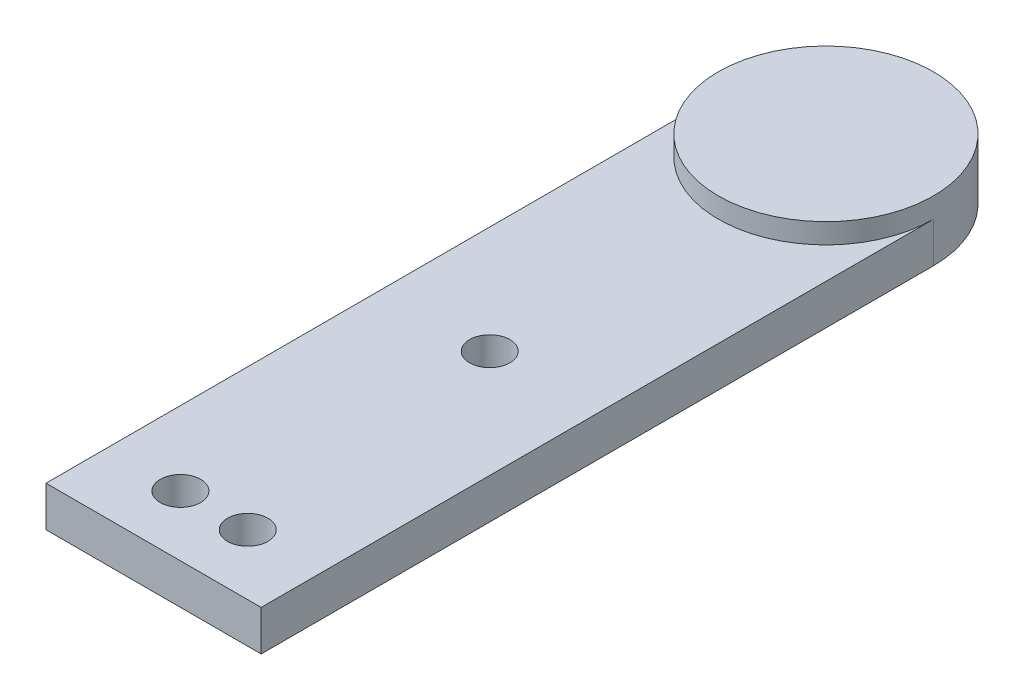
ISO-10303-21;
HEADER;
FILE_DESCRIPTION(('STEP AP214'),'2;1');
FILE_NAME('part.step','',(''),(''),'','','');
FILE_SCHEMA(('AUTOMOTIVE_DESIGN { 1 0 10303 214 1 1 1 1 }'));
ENDSEC;
DATA;
#1=APPLICATION_CONTEXT('core data for automotive mechanical design processes');
#2=APPLICATION_PROTOCOL_DEFINITION('international standard','automotive_design',2000,#1);
#3=PRODUCT_CONTEXT('',#1,'mechanical');
#4=PRODUCT('Part','Part','',(#3));
#5=PRODUCT_RELATED_PRODUCT_CATEGORY('part','',(#4));
#6=PRODUCT_DEFINITION_FORMATION('','',#4);
#7=PRODUCT_DEFINITION_CONTEXT('part definition',#1,'design');
#8=PRODUCT_DEFINITION('design','',#6,#7);
#9=PRODUCT_DEFINITION_SHAPE('','',#8);
#10=(LENGTH_UNIT() NAMED_UNIT(*) SI_UNIT(.MILLI.,.METRE.));
#11=(NAMED_UNIT(*) PLANE_ANGLE_UNIT() SI_UNIT($,.RADIAN.));
#12=(NAMED_UNIT(*) SI_UNIT($,.STERADIAN.) SOLID_ANGLE_UNIT());
#13=UNCERTAINTY_MEASURE_WITH_UNIT(LENGTH_MEASURE(1.E-05),#10,'distance_accuracy_value','');
#14=(GEOMETRIC_REPRESENTATION_CONTEXT(3) GLOBAL_UNCERTAINTY_ASSIGNED_CONTEXT((#13)) GLOBAL_UNIT_ASSIGNED_CONTEXT((#10,
#11,#12)) REPRESENTATION_CONTEXT('',''));
#15=CARTESIAN_POINT('',(0.,0.,0.));
#16=DIRECTION('',(0.,0.,1.));
#17=DIRECTION('',(1.,0.,0.));
#18=AXIS2_PLACEMENT_3D('',#15,#16,#17);
#19=CARTESIAN_POINT('',(0.,3.,0.));
#20=DIRECTION('',(0.,-1.,0.));
#21=DIRECTION('',(0.,0.,-1.));
#22=AXIS2_PLACEMENT_3D('',#19,#20,#21);
#23=CYLINDRICAL_SURFACE('',#22,8.);
#24=CARTESIAN_POINT('',(0.,3.,0.));
#25=DIRECTION('',(0.,1.,0.));
#26=DIRECTION('',(0.,0.,1.));
#27=AXIS2_PLACEMENT_3D('',#24,#25,#26);
#28=CIRCLE('',#27,8.);
#29=CARTESIAN_POINT('',(0.,3.,8.));
#30=VERTEX_POINT('',#29);
#31=EDGE_CURVE('E45',#30,#30,#28,.T.);
#32=ORIENTED_EDGE('',*,*,#31,.F.);
#33=EDGE_LOOP('',(#32));
#34=FACE_BOUND('',#33,.T.);
#35=DIRECTION('',(0.,-1.,0.));
#36=VECTOR('',#35,1.);
#37=CARTESIAN_POINT('',(-8.,1.5,0.));
#38=LINE('',#37,#36);
#39=CARTESIAN_POINT('',(-8.,1.5,0.));
#40=VERTEX_POINT('',#39);
#41=CARTESIAN_POINT('',(-8.,-1.5,0.));
#42=VERTEX_POINT('',#41);
#43=EDGE_CURVE('E55',#40,#42,#38,.T.);
#44=ORIENTED_EDGE('',*,*,#43,.F.);
#45=CARTESIAN_POINT('',(0.,1.5,0.));
#46=DIRECTION('',(0.,1.,0.));
#47=DIRECTION('',(0.,0.,1.));
#48=AXIS2_PLACEMENT_3D('',#45,#46,#47);
#49=CIRCLE('',#48,8.);
#50=CARTESIAN_POINT('',(8.,1.5,0.));
#51=VERTEX_POINT('',#50);
#52=EDGE_CURVE('E11',#40,#51,#49,.T.);
#53=ORIENTED_EDGE('',*,*,#52,.T.);
#54=DIRECTION('',(0.,-1.,0.));
#55=VECTOR('',#54,1.);
#56=CARTESIAN_POINT('',(8.,1.5,0.));
#57=LINE('',#56,#55);
#58=CARTESIAN_POINT('',(8.,-1.5,0.));
#59=VERTEX_POINT('',#58);
#60=EDGE_CURVE('E99',#51,#59,#57,.T.);
#61=ORIENTED_EDGE('',*,*,#60,.T.);
#62=CARTESIAN_POINT('',(0.,-1.5,0.));
#63=DIRECTION('',(0.,1.,0.));
#64=DIRECTION('',(0.,0.,1.));
#65=AXIS2_PLACEMENT_3D('',#62,#63,#64);
#66=CIRCLE('',#65,8.);
#67=EDGE_CURVE('E96',#59,#42,#66,.T.);
#68=ORIENTED_EDGE('',*,*,#67,.T.);
#69=EDGE_LOOP('',(#44,#53,#61,#68));
#70=FACE_BOUND('',#69,.T.);
#71=ADVANCED_FACE('F37',(#34,#70),#23,.T.);
#72=CARTESIAN_POINT('',(0.,3.,0.));
#73=DIRECTION('',(0.,1.,0.));
#74=DIRECTION('',(0.,0.,1.));
#75=AXIS2_PLACEMENT_3D('',#72,#73,#74);
#76=PLANE('',#75);
#77=ORIENTED_EDGE('',*,*,#31,.T.);
#78=EDGE_LOOP('',(#77));
#79=FACE_BOUND('',#78,.T.);
#80=ADVANCED_FACE('F106',(#79),#76,.T.);
#81=CARTESIAN_POINT('',(0.,-1.5,0.));
#82=DIRECTION('',(0.,1.,0.));
#83=DIRECTION('',(0.,0.,1.));
#84=AXIS2_PLACEMENT_3D('',#81,#82,#83);
#85=PLANE('',#84);
#86=CARTESIAN_POINT('',(0.,-1.5,25.));
#87=DIRECTION('',(0.,1.,0.));
#88=DIRECTION('',(0.,0.,1.));
#89=AXIS2_PLACEMENT_3D('',#86,#87,#88);
#90=CIRCLE('',#89,1.5);
#91=CARTESIAN_POINT('',(0.,-1.5,26.5));
#92=VERTEX_POINT('',#91);
#93=EDGE_CURVE('E153',#92,#92,#90,.F.);
#94=ORIENTED_EDGE('',*,*,#93,.F.);
#95=EDGE_LOOP('',(#94));
#96=FACE_BOUND('',#95,.T.);
#97=CARTESIAN_POINT('',(0.,-1.5,0.));
#98=DIRECTION('',(0.,1.,0.));
#99=DIRECTION('',(0.,0.,1.));
#100=AXIS2_PLACEMENT_3D('',#97,#98,#99);
#101=CIRCLE('',#100,3.3);
#102=CARTESIAN_POINT('',(0.,-1.5,3.3));
#103=VERTEX_POINT('',#102);
#104=EDGE_CURVE('E40',#103,#103,#101,.T.);
#105=ORIENTED_EDGE('',*,*,#104,.T.);
#106=EDGE_LOOP('',(#105));
#107=FACE_BOUND('',#106,.T.);
#108=CARTESIAN_POINT('',(-2.50307341777024,-1.5,45.5));
#109=DIRECTION('',(0.,-1.,0.));
#110=DIRECTION('',(0.,0.,-1.));
#111=AXIS2_PLACEMENT_3D('',#108,#109,#110);
#112=CIRCLE('',#111,1.5);
#113=CARTESIAN_POINT('',(-2.50307341777024,-1.5,44.));
#114=VERTEX_POINT('',#113);
#115=EDGE_CURVE('E159',#114,#114,#112,.T.);
#116=ORIENTED_EDGE('',*,*,#115,.F.);
#117=EDGE_LOOP('',(#116));
#118=FACE_BOUND('',#117,.T.);
#119=CARTESIAN_POINT('',(2.50307341776999,-1.5,45.5));
#120=DIRECTION('',(0.,-1.,0.));
#121=DIRECTION('',(0.,0.,-1.));
#122=AXIS2_PLACEMENT_3D('',#119,#120,#121);
#123=CIRCLE('',#122,1.5);
#124=CARTESIAN_POINT('',(2.50307341776999,-1.5,44.));
#125=VERTEX_POINT('',#124);
#126=EDGE_CURVE('E156',#125,#125,#123,.T.);
#127=ORIENTED_EDGE('',*,*,#126,.F.);
#128=EDGE_LOOP('',(#127));
#129=FACE_BOUND('',#128,.T.);
#130=ORIENTED_EDGE('',*,*,#67,.F.);
#131=DIRECTION('',(0.,0.,-1.));
#132=VECTOR('',#131,1.);
#133=CARTESIAN_POINT('',(8.,-1.5,0.));
#134=LINE('',#133,#132);
#135=CARTESIAN_POINT('',(8.00000000000001,-1.5,50.));
#136=VERTEX_POINT('',#135);
#137=EDGE_CURVE('E91',#136,#59,#134,.T.);
#138=ORIENTED_EDGE('',*,*,#137,.F.);
#139=DIRECTION('',(1.,0.,0.));
#140=VECTOR('',#139,1.);
#141=CARTESIAN_POINT('',(-8.00000000000001,-1.5,50.));
#142=LINE('',#141,#140);
#143=CARTESIAN_POINT('',(-8.00000000000001,-1.5,50.));
#144=VERTEX_POINT('',#143);
#145=EDGE_CURVE('E172',#144,#136,#142,.T.);
#146=ORIENTED_EDGE('',*,*,#145,.F.);
#147=DIRECTION('',(0.,0.,1.));
#148=VECTOR('',#147,1.);
#149=CARTESIAN_POINT('',(-8.,-1.5,0.));
#150=LINE('',#149,#148);
#151=EDGE_CURVE('E95',#42,#144,#150,.T.);
#152=ORIENTED_EDGE('',*,*,#151,.F.);
#153=EDGE_LOOP('',(#130,#138,#146,#152));
#154=FACE_BOUND('',#153,.T.);
#155=ADVANCED_FACE('F112',(#96,#107,#118,#129,#154),#85,.F.);
#156=CARTESIAN_POINT('',(-8.,1.5,0.));
#157=DIRECTION('',(1.,0.,0.));
#158=DIRECTION('',(0.,0.,-1.));
#159=AXIS2_PLACEMENT_3D('',#156,#157,#158);
#160=PLANE('',#159);
#161=ORIENTED_EDGE('',*,*,#151,.T.);
#162=DIRECTION('',(0.,-1.,0.));
#163=VECTOR('',#162,1.);
#164=CARTESIAN_POINT('',(-8.00000000000001,1.5,50.));
#165=LINE('',#164,#163);
#166=CARTESIAN_POINT('',(-8.00000000000001,1.5,50.));
#167=VERTEX_POINT('',#166);
#168=EDGE_CURVE('E79',#167,#144,#165,.T.);
#169=ORIENTED_EDGE('',*,*,#168,.F.);
#170=DIRECTION('',(0.,0.,1.));
#171=VECTOR('',#170,1.);
#172=CARTESIAN_POINT('',(-8.,1.5,0.));
#173=LINE('',#172,#171);
#174=EDGE_CURVE('E86',#40,#167,#173,.T.);
#175=ORIENTED_EDGE('',*,*,#174,.F.);
#176=ORIENTED_EDGE('',*,*,#43,.T.);
#177=EDGE_LOOP('',(#161,#169,#175,#176));
#178=FACE_BOUND('',#177,.T.);
#179=ADVANCED_FACE('F93',(#178),#160,.F.);
#180=CARTESIAN_POINT('',(-8.00000000000001,1.5,50.));
#181=DIRECTION('',(0.,0.,-1.));
#182=DIRECTION('',(-1.,0.,0.));
#183=AXIS2_PLACEMENT_3D('',#180,#181,#182);
#184=PLANE('',#183);
#185=ORIENTED_EDGE('',*,*,#145,.T.);
#186=DIRECTION('',(0.,-1.,0.));
#187=VECTOR('',#186,1.);
#188=CARTESIAN_POINT('',(8.00000000000001,1.5,50.));
#189=LINE('',#188,#187);
#190=CARTESIAN_POINT('',(8.00000000000001,1.5,50.));
#191=VERTEX_POINT('',#190);
#192=EDGE_CURVE('E82',#191,#136,#189,.T.);
#193=ORIENTED_EDGE('',*,*,#192,.F.);
#194=DIRECTION('',(1.,0.,0.));
#195=VECTOR('',#194,1.);
#196=CARTESIAN_POINT('',(-8.00000000000001,1.5,50.));
#197=LINE('',#196,#195);
#198=EDGE_CURVE('E75',#167,#191,#197,.T.);
#199=ORIENTED_EDGE('',*,*,#198,.F.);
#200=ORIENTED_EDGE('',*,*,#168,.T.);
#201=EDGE_LOOP('',(#185,#193,#199,#200));
#202=FACE_BOUND('',#201,.T.);
#203=ADVANCED_FACE('F77',(#202),#184,.F.);
#204=CARTESIAN_POINT('',(8.,1.5,0.));
#205=DIRECTION('',(-1.,0.,0.));
#206=DIRECTION('',(0.,0.,1.));
#207=AXIS2_PLACEMENT_3D('',#204,#205,#206);
#208=PLANE('',#207);
#209=ORIENTED_EDGE('',*,*,#137,.T.);
#210=ORIENTED_EDGE('',*,*,#60,.F.);
#211=DIRECTION('',(0.,0.,-1.));
#212=VECTOR('',#211,1.);
#213=CARTESIAN_POINT('',(8.,1.5,0.));
#214=LINE('',#213,#212);
#215=EDGE_CURVE('E85',#191,#51,#214,.T.);
#216=ORIENTED_EDGE('',*,*,#215,.F.);
#217=ORIENTED_EDGE('',*,*,#192,.T.);
#218=EDGE_LOOP('',(#209,#210,#216,#217));
#219=FACE_BOUND('',#218,.T.);
#220=ADVANCED_FACE('F123',(#219),#208,.F.);
#221=CARTESIAN_POINT('',(0.,1.5,0.));
#222=DIRECTION('',(0.,1.,0.));
#223=DIRECTION('',(0.,0.,1.));
#224=AXIS2_PLACEMENT_3D('',#221,#222,#223);
#225=PLANE('',#224);
#226=CARTESIAN_POINT('',(0.,1.5,25.));
#227=DIRECTION('',(0.,1.,0.));
#228=DIRECTION('',(0.,0.,1.));
#229=AXIS2_PLACEMENT_3D('',#226,#227,#228);
#230=CIRCLE('',#229,1.5);
#231=CARTESIAN_POINT('',(0.,1.5,26.5));
#232=VERTEX_POINT('',#231);
#233=EDGE_CURVE('E150',#232,#232,#230,.T.);
#234=ORIENTED_EDGE('',*,*,#233,.F.);
#235=EDGE_LOOP('',(#234));
#236=FACE_BOUND('',#235,.T.);
#237=CARTESIAN_POINT('',(-2.50307341777024,1.5,45.5));
#238=DIRECTION('',(0.,1.,0.));
#239=DIRECTION('',(0.,0.,1.));
#240=AXIS2_PLACEMENT_3D('',#237,#238,#239);
#241=CIRCLE('',#240,1.5);
#242=CARTESIAN_POINT('',(-2.50307341777024,1.5,47.));
#243=VERTEX_POINT('',#242);
#244=EDGE_CURVE('E162',#243,#243,#241,.F.);
#245=ORIENTED_EDGE('',*,*,#244,.T.);
#246=EDGE_LOOP('',(#245));
#247=FACE_BOUND('',#246,.T.);
#248=CARTESIAN_POINT('',(2.50307341776999,1.5,45.5));
#249=DIRECTION('',(0.,1.,0.));
#250=DIRECTION('',(0.,0.,1.));
#251=AXIS2_PLACEMENT_3D('',#248,#249,#250);
#252=CIRCLE('',#251,1.5);
#253=CARTESIAN_POINT('',(2.50307341776999,1.5,47.));
#254=VERTEX_POINT('',#253);
#255=EDGE_CURVE('E165',#254,#254,#252,.F.);
#256=ORIENTED_EDGE('',*,*,#255,.T.);
#257=EDGE_LOOP('',(#256));
#258=FACE_BOUND('',#257,.T.);
#259=ORIENTED_EDGE('',*,*,#52,.F.);
#260=ORIENTED_EDGE('',*,*,#174,.T.);
#261=ORIENTED_EDGE('',*,*,#198,.T.);
#262=ORIENTED_EDGE('',*,*,#215,.T.);
#263=EDGE_LOOP('',(#259,#260,#261,#262));
#264=FACE_BOUND('',#263,.T.);
#265=ADVANCED_FACE('F89',(#236,#247,#258,#264),#225,.T.);
#266=CARTESIAN_POINT('',(2.50307341776999,3.001,45.5));
#267=DIRECTION('',(0.,-1.,0.));
#268=DIRECTION('',(0.,0.,-1.));
#269=AXIS2_PLACEMENT_3D('',#266,#267,#268);
#270=CYLINDRICAL_SURFACE('',#269,1.5);
#271=ORIENTED_EDGE('',*,*,#255,.F.);
#272=EDGE_LOOP('',(#271));
#273=FACE_BOUND('',#272,.T.);
#274=ORIENTED_EDGE('',*,*,#126,.T.);
#275=EDGE_LOOP('',(#274));
#276=FACE_BOUND('',#275,.T.);
#277=ADVANCED_FACE('F129',(#273,#276),#270,.F.);
#278=CARTESIAN_POINT('',(-2.50307341777024,3.001,45.5));
#279=DIRECTION('',(0.,-1.,0.));
#280=DIRECTION('',(0.,0.,-1.));
#281=AXIS2_PLACEMENT_3D('',#278,#279,#280);
#282=CYLINDRICAL_SURFACE('',#281,1.5);
#283=ORIENTED_EDGE('',*,*,#244,.F.);
#284=EDGE_LOOP('',(#283));
#285=FACE_BOUND('',#284,.T.);
#286=ORIENTED_EDGE('',*,*,#115,.T.);
#287=EDGE_LOOP('',(#286));
#288=FACE_BOUND('',#287,.T.);
#289=ADVANCED_FACE('F133',(#285,#288),#282,.F.);
#290=CARTESIAN_POINT('',(0.,-1.5,0.));
#291=DIRECTION('',(1.,0.,0.));
#292=DIRECTION('',(0.,0.,-1.));
#293=AXIS2_PLACEMENT_3D('',#290,#291,#292);
#294=SPHERICAL_SURFACE('',#293,3.3);
#295=CARTESIAN_POINT('',(0.,-1.5,0.));
#296=DIRECTION('',(0.,1.,0.));
#297=DIRECTION('',(0.,0.,1.));
#298=AXIS2_PLACEMENT_3D('',#295,#296,#297);
#299=SPHERICAL_SURFACE('',#298,3.3);
#300=ORIENTED_EDGE('',*,*,#104,.F.);
#301=EDGE_LOOP('',(#300));
#302=FACE_BOUND('',#301,.T.);
#303=ADVANCED_FACE('F137',(#302),#299,.F.);
#304=CARTESIAN_POINT('',(0.,-1.501,25.));
#305=DIRECTION('',(0.,1.,0.));
#306=DIRECTION('',(0.,0.,1.));
#307=AXIS2_PLACEMENT_3D('',#304,#305,#306);
#308=CYLINDRICAL_SURFACE('',#307,1.5);
#309=CARTESIAN_POINT('',(0.,1.5,26.5));
#310=CARTESIAN_POINT('',(0.,1.46875,26.5));
#311=CARTESIAN_POINT('',(0.,1.4375,26.5));
#312=CARTESIAN_POINT('',(0.,1.375,26.5));
#313=CARTESIAN_POINT('',(0.,1.34375,26.5));
#314=CARTESIAN_POINT('',(0.,1.28125,26.5));
#315=CARTESIAN_POINT('',(0.,1.25,26.5));
#316=CARTESIAN_POINT('',(0.,1.1875,26.5));
#317=CARTESIAN_POINT('',(0.,1.15625,26.5));
#318=CARTESIAN_POINT('',(0.,1.09375,26.5));
#319=CARTESIAN_POINT('',(0.,1.0625,26.5));
#320=CARTESIAN_POINT('',(0.,1.,26.5));
#321=CARTESIAN_POINT('',(0.,0.96875,26.5));
#322=CARTESIAN_POINT('',(0.,0.90625,26.5));
#323=CARTESIAN_POINT('',(0.,0.874999999999999,26.5));
#324=CARTESIAN_POINT('',(0.,0.8125,26.5));
#325=CARTESIAN_POINT('',(0.,0.78125,26.5));
#326=CARTESIAN_POINT('',(0.,0.71875,26.5));
#327=CARTESIAN_POINT('',(0.,0.6875,26.5));
#328=CARTESIAN_POINT('',(0.,0.625,26.5));
#329=CARTESIAN_POINT('',(0.,0.59375,26.5));
#330=CARTESIAN_POINT('',(0.,0.53125,26.5));
#331=CARTESIAN_POINT('',(0.,0.5,26.5));
#332=CARTESIAN_POINT('',(0.,0.4375,26.5));
#333=CARTESIAN_POINT('',(0.,0.40625,26.5));
#334=CARTESIAN_POINT('',(0.,0.34375,26.5));
#335=CARTESIAN_POINT('',(0.,0.3125,26.5));
#336=CARTESIAN_POINT('',(0.,0.25,26.5));
#337=CARTESIAN_POINT('',(0.,0.21875,26.5));
#338=CARTESIAN_POINT('',(0.,0.15625,26.5));
#339=CARTESIAN_POINT('',(0.,0.125,26.5));
#340=CARTESIAN_POINT('',(0.,0.0624999999999998,26.5));
#341=CARTESIAN_POINT('',(0.,0.0312499999999998,26.5));
#342=CARTESIAN_POINT('',(0.,-0.0312500000000002,26.5));
#343=CARTESIAN_POINT('',(0.,-0.0625000000000003,26.5));
#344=CARTESIAN_POINT('',(0.,-0.125,26.5));
#345=CARTESIAN_POINT('',(0.,-0.15625,26.5));
#346=CARTESIAN_POINT('',(0.,-0.21875,26.5));
#347=CARTESIAN_POINT('',(0.,-0.25,26.5));
#348=CARTESIAN_POINT('',(0.,-0.3125,26.5));
#349=CARTESIAN_POINT('',(0.,-0.34375,26.5));
#350=CARTESIAN_POINT('',(0.,-0.40625,26.5));
#351=CARTESIAN_POINT('',(0.,-0.4375,26.5));
#352=CARTESIAN_POINT('',(0.,-0.5,26.5));
#353=CARTESIAN_POINT('',(0.,-0.53125,26.5));
#354=CARTESIAN_POINT('',(0.,-0.59375,26.5));
#355=CARTESIAN_POINT('',(0.,-0.625,26.5));
#356=CARTESIAN_POINT('',(0.,-0.6875,26.5));
#357=CARTESIAN_POINT('',(0.,-0.71875,26.5));
#358=CARTESIAN_POINT('',(0.,-0.78125,26.5));
#359=CARTESIAN_POINT('',(0.,-0.8125,26.5));
#360=CARTESIAN_POINT('',(0.,-0.875,26.5));
#361=CARTESIAN_POINT('',(0.,-0.90625,26.5));
#362=CARTESIAN_POINT('',(0.,-0.96875,26.5));
#363=CARTESIAN_POINT('',(0.,-1.,26.5));
#364=CARTESIAN_POINT('',(0.,-1.0625,26.5));
#365=CARTESIAN_POINT('',(0.,-1.09375,26.5));
#366=CARTESIAN_POINT('',(0.,-1.15625,26.5));
#367=CARTESIAN_POINT('',(0.,-1.1875,26.5));
#368=CARTESIAN_POINT('',(0.,-1.25,26.5));
#369=CARTESIAN_POINT('',(0.,-1.28125,26.5));
#370=CARTESIAN_POINT('',(0.,-1.34375,26.5));
#371=CARTESIAN_POINT('',(0.,-1.375,26.5));
#372=CARTESIAN_POINT('',(0.,-1.4375,26.5));
#373=CARTESIAN_POINT('',(0.,-1.46875,26.5));
#374=CARTESIAN_POINT('',(0.,-1.5,26.5));
#375=B_SPLINE_CURVE_WITH_KNOTS('',3,(#309,#310,#311,#312,#313,#314,#315,#316,#317,#318,#319,
#320,#321,#322,#323,#324,#325,#326,#327,#328,#329,#330,#331,#332,#333,#334,#335,#336,#337,#338,
#339,#340,#341,#342,#343,#344,#345,#346,#347,#348,#349,#350,#351,#352,#353,#354,#355,#356,#357,
#358,#359,#360,#361,#362,#363,#364,#365,#366,#367,#368,#369,#370,#371,#372,#373,#374),
.UNSPECIFIED.,.F.,.F.,(4,2,2,2,2,2,2,2,2,2,2,2,2,2,2,2,2,2,2,2,2,2,2,2,2,2,2,2,2,2,2,2,4),(0.,
0.0937500000000001,0.1875,0.28125,0.375,0.46875,0.5625,0.65625,0.75,0.84375,0.9375,1.03125,
1.125,1.21875,1.3125,1.40625,1.5,1.59375,1.6875,1.78125,1.875,1.96875,2.0625,2.15625,2.25,
2.34375,2.4375,2.53125,2.625,2.71875,2.8125,2.90625,3.),.UNSPECIFIED.);
#376=EDGE_CURVE('BSEAM141',#232,#92,#375,.T.);
#377=ORIENTED_EDGE('',*,*,#233,.T.);
#378=ORIENTED_EDGE('',*,*,#93,.T.);
#379=ORIENTED_EDGE('',*,*,#376,.T.);
#380=ORIENTED_EDGE('',*,*,#376,.F.);
#381=EDGE_LOOP('',(#377,#379,#378,#380));
#382=FACE_BOUND('',#381,.T.);
#383=ADVANCED_FACE('F141',(#382),#308,.F.);
#384=CLOSED_SHELL('',(#71,#80,#155,#179,#203,#220,#265,#277,#289,#303,#383));
#385=MANIFOLD_SOLID_BREP('B2',#384);
#386=ADVANCED_BREP_SHAPE_REPRESENTATION('',(#18,#385),#14);
#387=SHAPE_DEFINITION_REPRESENTATION(#9,#386);
ENDSEC;
END-ISO-10303-21;
